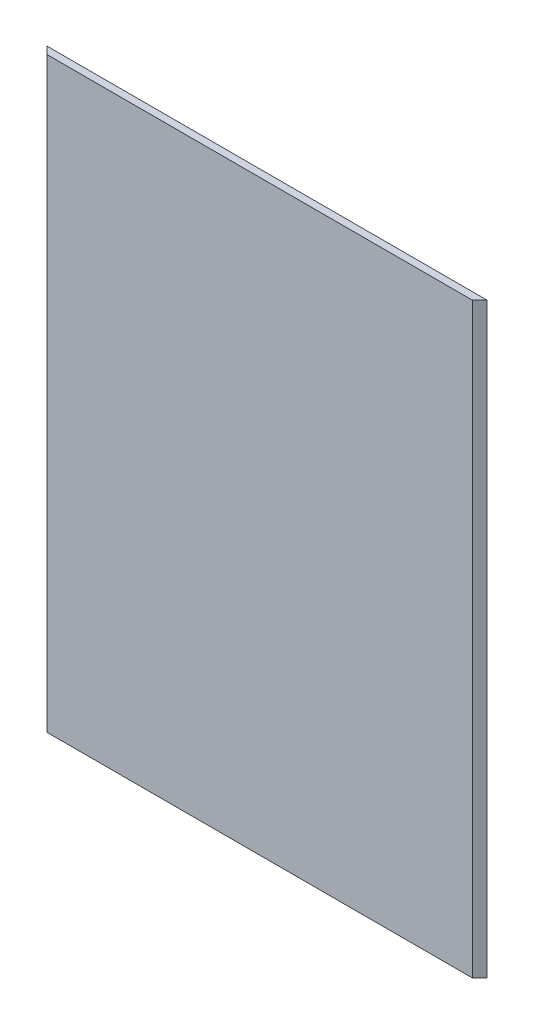
ISO-10303-21;
HEADER;
FILE_DESCRIPTION(('STEP AP214'),'2;1');
FILE_NAME('part.step','',(''),(''),'','','');
FILE_SCHEMA(('AUTOMOTIVE_DESIGN { 1 0 10303 214 1 1 1 1 }'));
ENDSEC;
DATA;
#1=APPLICATION_CONTEXT('core data for automotive mechanical design processes');
#2=APPLICATION_PROTOCOL_DEFINITION('international standard','automotive_design',2000,#1);
#3=PRODUCT_CONTEXT('',#1,'mechanical');
#4=PRODUCT('Part','Part','',(#3));
#5=PRODUCT_RELATED_PRODUCT_CATEGORY('part','',(#4));
#6=PRODUCT_DEFINITION_FORMATION('','',#4);
#7=PRODUCT_DEFINITION_CONTEXT('part definition',#1,'design');
#8=PRODUCT_DEFINITION('design','',#6,#7);
#9=PRODUCT_DEFINITION_SHAPE('','',#8);
#10=(LENGTH_UNIT() NAMED_UNIT(*) SI_UNIT(.MILLI.,.METRE.));
#11=(NAMED_UNIT(*) PLANE_ANGLE_UNIT() SI_UNIT($,.RADIAN.));
#12=(NAMED_UNIT(*) SI_UNIT($,.STERADIAN.) SOLID_ANGLE_UNIT());
#13=UNCERTAINTY_MEASURE_WITH_UNIT(LENGTH_MEASURE(1.E-05),#10,'distance_accuracy_value','');
#14=(GEOMETRIC_REPRESENTATION_CONTEXT(3) GLOBAL_UNCERTAINTY_ASSIGNED_CONTEXT((#13)) GLOBAL_UNIT_ASSIGNED_CONTEXT((#10,
#11,#12)) REPRESENTATION_CONTEXT('',''));
#15=CARTESIAN_POINT('',(0.,0.,0.));
#16=DIRECTION('',(0.,0.,1.));
#17=DIRECTION('',(1.,0.,0.));
#18=AXIS2_PLACEMENT_3D('',#15,#16,#17);
#19=CARTESIAN_POINT('',(150.,-200.,5.));
#20=DIRECTION('',(0.,1.,0.));
#21=DIRECTION('',(-1.,0.,0.));
#22=AXIS2_PLACEMENT_3D('',#19,#20,#21);
#23=PLANE('',#22);
#24=DIRECTION('',(1.,0.,0.));
#25=VECTOR('',#24,1.);
#26=CARTESIAN_POINT('',(150.,-200.,5.));
#27=LINE('',#26,#25);
#28=CARTESIAN_POINT('',(-145.,-200.,5.));
#29=VERTEX_POINT('',#28);
#30=CARTESIAN_POINT('',(145.,-200.,5.));
#31=VERTEX_POINT('',#30);
#32=EDGE_CURVE('E41',#29,#31,#27,.T.);
#33=ORIENTED_EDGE('',*,*,#32,.F.);
#34=DIRECTION('',(-0.707106781186548,0.,-0.707106781186547));
#35=VECTOR('',#34,1.);
#36=CARTESIAN_POINT('',(-150.,-200.,0.));
#37=LINE('',#36,#35);
#38=CARTESIAN_POINT('',(-150.,-200.,0.));
#39=VERTEX_POINT('',#38);
#40=EDGE_CURVE('E73',#29,#39,#37,.T.);
#41=ORIENTED_EDGE('',*,*,#40,.T.);
#42=DIRECTION('',(1.,0.,0.));
#43=VECTOR('',#42,1.);
#44=CARTESIAN_POINT('',(150.,-200.,0.));
#45=LINE('',#44,#43);
#46=CARTESIAN_POINT('',(150.,-200.,0.));
#47=VERTEX_POINT('',#46);
#48=EDGE_CURVE('E96',#39,#47,#45,.T.);
#49=ORIENTED_EDGE('',*,*,#48,.T.);
#50=DIRECTION('',(-0.707106781186548,0.,0.707106781186547));
#51=VECTOR('',#50,1.);
#52=CARTESIAN_POINT('',(150.,-200.,0.));
#53=LINE('',#52,#51);
#54=EDGE_CURVE('E57',#47,#31,#53,.T.);
#55=ORIENTED_EDGE('',*,*,#54,.T.);
#56=EDGE_LOOP('',(#33,#41,#49,#55));
#57=FACE_BOUND('',#56,.T.);
#58=ADVANCED_FACE('F33',(#57),#23,.F.);
#59=CARTESIAN_POINT('',(150.,200.,5.));
#60=DIRECTION('',(0.,-1.,0.));
#61=DIRECTION('',(1.,0.,0.));
#62=AXIS2_PLACEMENT_3D('',#59,#60,#61);
#63=PLANE('',#62);
#64=DIRECTION('',(-1.,0.,0.));
#65=VECTOR('',#64,1.);
#66=CARTESIAN_POINT('',(150.,200.,0.));
#67=LINE('',#66,#65);
#68=CARTESIAN_POINT('',(150.,200.,0.));
#69=VERTEX_POINT('',#68);
#70=CARTESIAN_POINT('',(-150.,200.,0.));
#71=VERTEX_POINT('',#70);
#72=EDGE_CURVE('E36',#69,#71,#67,.T.);
#73=ORIENTED_EDGE('',*,*,#72,.T.);
#74=DIRECTION('',(-0.707106781186548,0.,-0.707106781186547));
#75=VECTOR('',#74,1.);
#76=CARTESIAN_POINT('',(-150.,200.,0.));
#77=LINE('',#76,#75);
#78=CARTESIAN_POINT('',(-145.,200.,5.));
#79=VERTEX_POINT('',#78);
#80=EDGE_CURVE('E49',#79,#71,#77,.T.);
#81=ORIENTED_EDGE('',*,*,#80,.F.);
#82=DIRECTION('',(-1.,0.,0.));
#83=VECTOR('',#82,1.);
#84=CARTESIAN_POINT('',(150.,200.,5.));
#85=LINE('',#84,#83);
#86=CARTESIAN_POINT('',(145.,200.,5.));
#87=VERTEX_POINT('',#86);
#88=EDGE_CURVE('E11',#87,#79,#85,.T.);
#89=ORIENTED_EDGE('',*,*,#88,.F.);
#90=DIRECTION('',(-0.707106781186548,0.,0.707106781186547));
#91=VECTOR('',#90,1.);
#92=CARTESIAN_POINT('',(150.,200.,0.));
#93=LINE('',#92,#91);
#94=EDGE_CURVE('E100',#69,#87,#93,.T.);
#95=ORIENTED_EDGE('',*,*,#94,.F.);
#96=EDGE_LOOP('',(#73,#81,#89,#95));
#97=FACE_BOUND('',#96,.T.);
#98=ADVANCED_FACE('F104',(#97),#63,.F.);
#99=CARTESIAN_POINT('',(0.,0.,5.));
#100=DIRECTION('',(0.,0.,1.));
#101=DIRECTION('',(1.,0.,0.));
#102=AXIS2_PLACEMENT_3D('',#99,#100,#101);
#103=PLANE('',#102);
#104=DIRECTION('',(0.,1.,0.));
#105=VECTOR('',#104,1.);
#106=CARTESIAN_POINT('',(-145.,-200.,5.));
#107=LINE('',#106,#105);
#108=EDGE_CURVE('E76',#29,#79,#107,.T.);
#109=ORIENTED_EDGE('',*,*,#108,.F.);
#110=ORIENTED_EDGE('',*,*,#32,.T.);
#111=DIRECTION('',(0.,1.,0.));
#112=VECTOR('',#111,1.);
#113=CARTESIAN_POINT('',(145.,-200.,5.));
#114=LINE('',#113,#112);
#115=EDGE_CURVE('E92',#31,#87,#114,.T.);
#116=ORIENTED_EDGE('',*,*,#115,.T.);
#117=ORIENTED_EDGE('',*,*,#88,.T.);
#118=EDGE_LOOP('',(#109,#110,#116,#117));
#119=FACE_BOUND('',#118,.T.);
#120=ADVANCED_FACE('F85',(#119),#103,.T.);
#121=CARTESIAN_POINT('',(0.,0.,0.));
#122=DIRECTION('',(0.,0.,1.));
#123=DIRECTION('',(1.,0.,0.));
#124=AXIS2_PLACEMENT_3D('',#121,#122,#123);
#125=PLANE('',#124);
#126=DIRECTION('',(0.,-1.,0.));
#127=VECTOR('',#126,1.);
#128=CARTESIAN_POINT('',(-150.,-200.,0.));
#129=LINE('',#128,#127);
#130=EDGE_CURVE('E78',#71,#39,#129,.T.);
#131=ORIENTED_EDGE('',*,*,#130,.F.);
#132=ORIENTED_EDGE('',*,*,#72,.F.);
#133=DIRECTION('',(0.,1.,0.));
#134=VECTOR('',#133,1.);
#135=CARTESIAN_POINT('',(150.,-200.,0.));
#136=LINE('',#135,#134);
#137=EDGE_CURVE('E90',#47,#69,#136,.T.);
#138=ORIENTED_EDGE('',*,*,#137,.F.);
#139=ORIENTED_EDGE('',*,*,#48,.F.);
#140=EDGE_LOOP('',(#131,#132,#138,#139));
#141=FACE_BOUND('',#140,.T.);
#142=ADVANCED_FACE('F105',(#141),#125,.F.);
#143=CARTESIAN_POINT('',(150.,-200.,0.));
#144=DIRECTION('',(-0.707106781186547,0.,-0.707106781186548));
#145=DIRECTION('',(-0.707106781186548,0.,0.707106781186547));
#146=AXIS2_PLACEMENT_3D('',#143,#144,#145);
#147=PLANE('',#146);
#148=ORIENTED_EDGE('',*,*,#94,.T.);
#149=ORIENTED_EDGE('',*,*,#115,.F.);
#150=ORIENTED_EDGE('',*,*,#54,.F.);
#151=ORIENTED_EDGE('',*,*,#137,.T.);
#152=EDGE_LOOP('',(#148,#149,#150,#151));
#153=FACE_BOUND('',#152,.T.);
#154=ADVANCED_FACE('F99',(#153),#147,.F.);
#155=CARTESIAN_POINT('',(-150.,-200.,0.));
#156=DIRECTION('',(0.707106781186547,0.,-0.707106781186548));
#157=DIRECTION('',(-0.707106781186548,0.,-0.707106781186547));
#158=AXIS2_PLACEMENT_3D('',#155,#156,#157);
#159=PLANE('',#158);
#160=ORIENTED_EDGE('',*,*,#80,.T.);
#161=ORIENTED_EDGE('',*,*,#130,.T.);
#162=ORIENTED_EDGE('',*,*,#40,.F.);
#163=ORIENTED_EDGE('',*,*,#108,.T.);
#164=EDGE_LOOP('',(#160,#161,#162,#163));
#165=FACE_BOUND('',#164,.T.);
#166=ADVANCED_FACE('F75',(#165),#159,.F.);
#167=CLOSED_SHELL('',(#58,#98,#120,#142,#154,#166));
#168=MANIFOLD_SOLID_BREP('B2',#167);
#169=ADVANCED_BREP_SHAPE_REPRESENTATION('',(#18,#168),#14);
#170=SHAPE_DEFINITION_REPRESENTATION(#9,#169);
ENDSEC;
END-ISO-10303-21;
